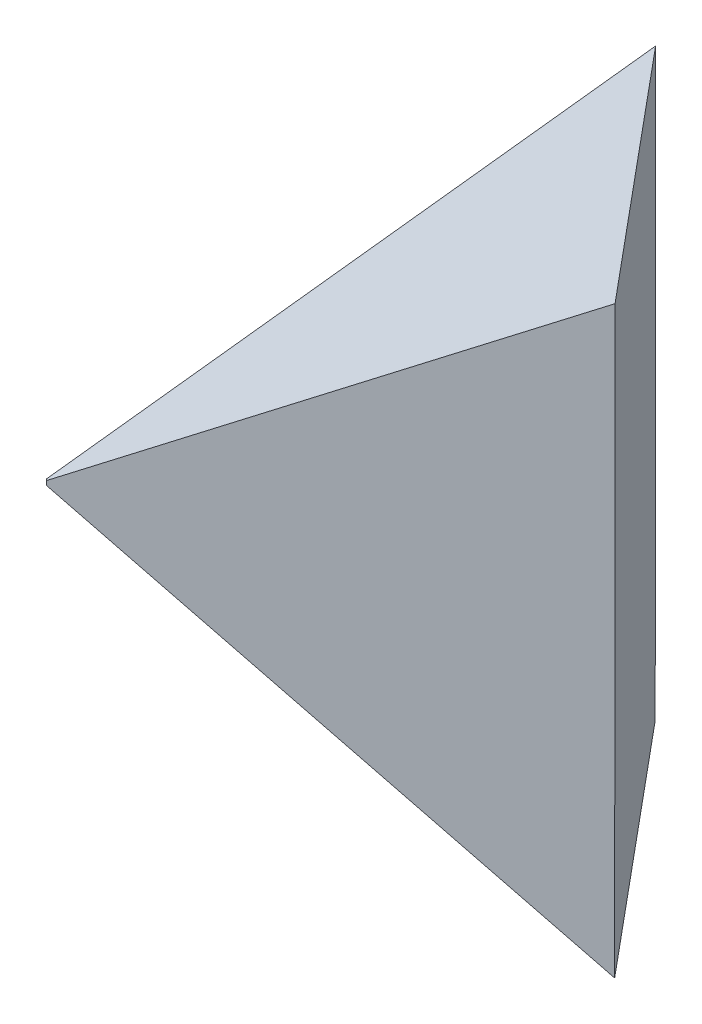
ISO-10303-21;
HEADER;
FILE_DESCRIPTION(('STEP AP214'),'2;1');
FILE_NAME('part.step','',(''),(''),'','','');
FILE_SCHEMA(('AUTOMOTIVE_DESIGN { 1 0 10303 214 1 1 1 1 }'));
ENDSEC;
DATA;
#1=APPLICATION_CONTEXT('core data for automotive mechanical design processes');
#2=APPLICATION_PROTOCOL_DEFINITION('international standard','automotive_design',2000,#1);
#3=PRODUCT_CONTEXT('',#1,'mechanical');
#4=PRODUCT('Part','Part','',(#3));
#5=PRODUCT_RELATED_PRODUCT_CATEGORY('part','',(#4));
#6=PRODUCT_DEFINITION_FORMATION('','',#4);
#7=PRODUCT_DEFINITION_CONTEXT('part definition',#1,'design');
#8=PRODUCT_DEFINITION('design','',#6,#7);
#9=PRODUCT_DEFINITION_SHAPE('','',#8);
#10=(LENGTH_UNIT() NAMED_UNIT(*) SI_UNIT(.MILLI.,.METRE.));
#11=(NAMED_UNIT(*) PLANE_ANGLE_UNIT() SI_UNIT($,.RADIAN.));
#12=(NAMED_UNIT(*) SI_UNIT($,.STERADIAN.) SOLID_ANGLE_UNIT());
#13=UNCERTAINTY_MEASURE_WITH_UNIT(LENGTH_MEASURE(1.E-05),#10,'distance_accuracy_value','');
#14=(GEOMETRIC_REPRESENTATION_CONTEXT(3) GLOBAL_UNCERTAINTY_ASSIGNED_CONTEXT((#13)) GLOBAL_UNIT_ASSIGNED_CONTEXT((#10,
#11,#12)) REPRESENTATION_CONTEXT('',''));
#15=CARTESIAN_POINT('',(0.,0.,0.));
#16=DIRECTION('',(0.,0.,1.));
#17=DIRECTION('',(1.,0.,0.));
#18=AXIS2_PLACEMENT_3D('',#15,#16,#17);
#19=CARTESIAN_POINT('',(534.59281678404,330.22125626934,-101.5762576263));
#20=DIRECTION('',(-0.442152801707964,0.823626691240933,0.355161897473971));
#21=DIRECTION('',(0.62624167613197,0.,0.779628990658647));
#22=AXIS2_PLACEMENT_3D('',#19,#20,#21);
#23=PLANE('',#22);
#24=DIRECTION('',(-0.641470473020888,-0.0136095682998176,-0.767026995543866));
#25=VECTOR('',#24,1.);
#26=CARTESIAN_POINT('',(210.43033605346,35.965847138926,177.2466134144));
#27=LINE('',#26,#25);
#28=CARTESIAN_POINT('',(210.43033605346,35.965847138926,177.2466134144));
#29=VERTEX_POINT('',#28);
#30=CARTESIAN_POINT('',(207.96796166974,35.913604902121,174.30227270835));
#31=VERTEX_POINT('',#30);
#32=EDGE_CURVE('E96',#29,#31,#27,.T.);
#33=ORIENTED_EDGE('',*,*,#32,.F.);
#34=DIRECTION('',(-0.791194023562528,-0.544669273675364,0.278114004309186));
#35=VECTOR('',#34,1.);
#36=CARTESIAN_POINT('',(910.249755232,517.73153721776,-68.74814282113));
#37=LINE('',#36,#35);
#38=CARTESIAN_POINT('',(910.249755232,517.73153721776,-68.74814282113));
#39=VERTEX_POINT('',#38);
#40=EDGE_CURVE('E71',#39,#29,#37,.T.);
#41=ORIENTED_EDGE('',*,*,#40,.F.);
#42=DIRECTION('',(0.641470473020888,0.0136095682998176,0.767026995543866));
#43=VECTOR('',#42,1.);
#44=CARTESIAN_POINT('',(565.51734151185,510.41762406508,-480.9558416682));
#45=LINE('',#44,#43);
#46=CARTESIAN_POINT('',(565.51734151185,510.41762406508,-480.9558416682));
#47=VERTEX_POINT('',#46);
#48=EDGE_CURVE('E62',#47,#39,#45,.T.);
#49=ORIENTED_EDGE('',*,*,#48,.F.);
#50=DIRECTION('',(0.404234184859981,0.536459454869976,-0.740814401230966));
#51=VECTOR('',#50,1.);
#52=CARTESIAN_POINT('',(207.96796166974,35.913604902121,174.30227270835));
#53=LINE('',#52,#51);
#54=EDGE_CURVE('E9',#31,#47,#53,.T.);
#55=ORIENTED_EDGE('',*,*,#54,.F.);
#56=EDGE_LOOP('',(#33,#41,#49,#55));
#57=FACE_BOUND('',#56,.T.);
#58=ADVANCED_FACE('F14',(#57),#23,.T.);
#59=CARTESIAN_POINT('',(452.14653410095,30.378723241934,-264.393615672));
#60=DIRECTION('',(-0.873765212166275,-0.0129732288748441,-0.486174916404153));
#61=DIRECTION('',(-0.486215834323044,0.,0.873838750830807));
#62=AXIS2_PLACEMENT_3D('',#59,#60,#61);
#63=PLANE('',#62);
#64=DIRECTION('',(0.00930380667661084,-0.99990710671209,0.0099607794865899));
#65=VECTOR('',#64,1.);
#66=CARTESIAN_POINT('',(207.96796166974,35.913604902121,174.30227270835));
#67=LINE('',#66,#65);
#68=CARTESIAN_POINT('',(208.03190495958,29.041433955026,174.37073124709));
#69=VERTEX_POINT('',#68);
#70=EDGE_CURVE('E83',#31,#69,#67,.T.);
#71=ORIENTED_EDGE('',*,*,#70,.F.);
#72=ORIENTED_EDGE('',*,*,#54,.T.);
#73=DIRECTION('',(-0.00930380667661284,0.99990710671209,-0.0099607794865899));
#74=VECTOR('',#73,1.);
#75=CARTESIAN_POINT('',(574.46940208985,-451.6863085282,-471.371646245));
#76=LINE('',#75,#74);
#77=CARTESIAN_POINT('',(574.46940208985,-451.6863085282,-471.371646245));
#78=VERTEX_POINT('',#77);
#79=EDGE_CURVE('E85',#78,#47,#76,.T.);
#80=ORIENTED_EDGE('',*,*,#79,.F.);
#81=DIRECTION('',(0.414282813217033,-0.543495802442044,-0.730056205645058));
#82=VECTOR('',#81,1.);
#83=CARTESIAN_POINT('',(208.03190495958,29.041433955026,174.37073124709));
#84=LINE('',#83,#82);
#85=EDGE_CURVE('E24',#69,#78,#84,.T.);
#86=ORIENTED_EDGE('',*,*,#85,.F.);
#87=EDGE_LOOP('',(#71,#72,#80,#86));
#88=FACE_BOUND('',#87,.T.);
#89=ADVANCED_FACE('F81',(#88),#63,.T.);
#90=CARTESIAN_POINT('',(540.12720158164,-264.5751411625,-95.65107146069));
#91=DIRECTION('',(-0.426817780110877,-0.824472590514762,0.371579776186892));
#92=DIRECTION('',(-0.888056524179931,0.459734281799236,0.));
#93=AXIS2_PLACEMENT_3D('',#90,#91,#92);
#94=PLANE('',#93);
#95=DIRECTION('',(0.641470473020888,0.0136095682998176,0.767026995543866));
#96=VECTOR('',#95,1.);
#97=CARTESIAN_POINT('',(208.03190495958,29.041433955026,174.37073124709));
#98=LINE('',#97,#96);
#99=CARTESIAN_POINT('',(210.4942793433,29.093676191831,177.31507195314));
#100=VERTEX_POINT('',#99);
#101=EDGE_CURVE('E89',#69,#100,#98,.T.);
#102=ORIENTED_EDGE('',*,*,#101,.F.);
#103=ORIENTED_EDGE('',*,*,#85,.T.);
#104=DIRECTION('',(-0.641470473020888,-0.0136095682998176,-0.767026995543866));
#105=VECTOR('',#104,1.);
#106=CARTESIAN_POINT('',(919.20181581,-444.3723953755,-59.16394739797));
#107=LINE('',#106,#105);
#108=CARTESIAN_POINT('',(919.20181581,-444.3723953755,-59.16394739797));
#109=VERTEX_POINT('',#108);
#110=EDGE_CURVE('E52',#109,#78,#107,.T.);
#111=ORIENTED_EDGE('',*,*,#110,.F.);
#112=DIRECTION('',(0.801242651909787,-0.535285983641858,-0.267355808758929));
#113=VECTOR('',#112,1.);
#114=CARTESIAN_POINT('',(210.4942793433,29.093676191831,177.31507195314));
#115=LINE('',#114,#113);
#116=EDGE_CURVE('E91',#100,#109,#115,.T.);
#117=ORIENTED_EDGE('',*,*,#116,.F.);
#118=EDGE_LOOP('',(#102,#103,#111,#117));
#119=FACE_BOUND('',#118,.T.);
#120=ADVANCED_FACE('F16',(#119),#94,.T.);
#121=CARTESIAN_POINT('',(742.35957866093,33.022614344768,-270.0598945331));
#122=DIRECTION('',(0.767091305793029,0.000746724953363228,-0.641537505512024));
#123=DIRECTION('',(0.,-0.999999322597508,-0.00116396070551465));
#124=AXIS2_PLACEMENT_3D('',#121,#122,#123);
#125=PLANE('',#124);
#126=DIRECTION('',(0.00930380667661284,-0.99990710671209,0.0099607794865899));
#127=VECTOR('',#126,1.);
#128=CARTESIAN_POINT('',(910.249755232,517.73153721776,-68.74814282113));
#129=LINE('',#128,#127);
#130=EDGE_CURVE('E113',#39,#109,#129,.T.);
#131=ORIENTED_EDGE('',*,*,#130,.T.);
#132=ORIENTED_EDGE('',*,*,#110,.T.);
#133=ORIENTED_EDGE('',*,*,#79,.T.);
#134=ORIENTED_EDGE('',*,*,#48,.T.);
#135=EDGE_LOOP('',(#131,#132,#133,#134));
#136=FACE_BOUND('',#135,.T.);
#137=ADVANCED_FACE('F161',(#136),#125,.T.);
#138=CARTESIAN_POINT('',(685.45305583866,35.328601961052,14.578539610758));
#139=DIRECTION('',(0.323963347202056,0.0124380243055622,0.945987867375165));
#140=DIRECTION('',(0.0383650416777523,-0.999263790786529,0.));
#141=AXIS2_PLACEMENT_3D('',#138,#139,#140);
#142=PLANE('',#141);
#143=DIRECTION('',(-0.00930380667661584,0.99990710671209,-0.0099607794865899));
#144=VECTOR('',#143,1.);
#145=CARTESIAN_POINT('',(210.4942793433,29.093676191831,177.31507195314));
#146=LINE('',#145,#144);
#147=EDGE_CURVE('E94',#100,#29,#146,.T.);
#148=ORIENTED_EDGE('',*,*,#147,.F.);
#149=ORIENTED_EDGE('',*,*,#116,.T.);
#150=ORIENTED_EDGE('',*,*,#130,.F.);
#151=ORIENTED_EDGE('',*,*,#40,.T.);
#152=EDGE_LOOP('',(#148,#149,#150,#151));
#153=FACE_BOUND('',#152,.T.);
#154=ADVANCED_FACE('F155',(#153),#142,.T.);
#155=CARTESIAN_POINT('',(209.23112050652,32.503640546976,175.80867233075));
#156=DIRECTION('',(-0.767091305793029,-0.000746724953363428,0.641537505512024));
#157=DIRECTION('',(-0.000973449436754686,0.999999526197985,0.));
#158=AXIS2_PLACEMENT_3D('',#155,#156,#157);
#159=PLANE('',#158);
#160=ORIENTED_EDGE('',*,*,#32,.T.);
#161=ORIENTED_EDGE('',*,*,#70,.T.);
#162=ORIENTED_EDGE('',*,*,#101,.T.);
#163=ORIENTED_EDGE('',*,*,#147,.T.);
#164=EDGE_LOOP('',(#160,#161,#162,#163));
#165=FACE_BOUND('',#164,.T.);
#166=ADVANCED_FACE('F95',(#165),#159,.T.);
#167=CLOSED_SHELL('',(#58,#89,#120,#137,#154,#166));
#168=MANIFOLD_SOLID_BREP('B1',#167);
#169=ADVANCED_BREP_SHAPE_REPRESENTATION('',(#18,#168),#14);
#170=SHAPE_DEFINITION_REPRESENTATION(#9,#169);
ENDSEC;
END-ISO-10303-21;
